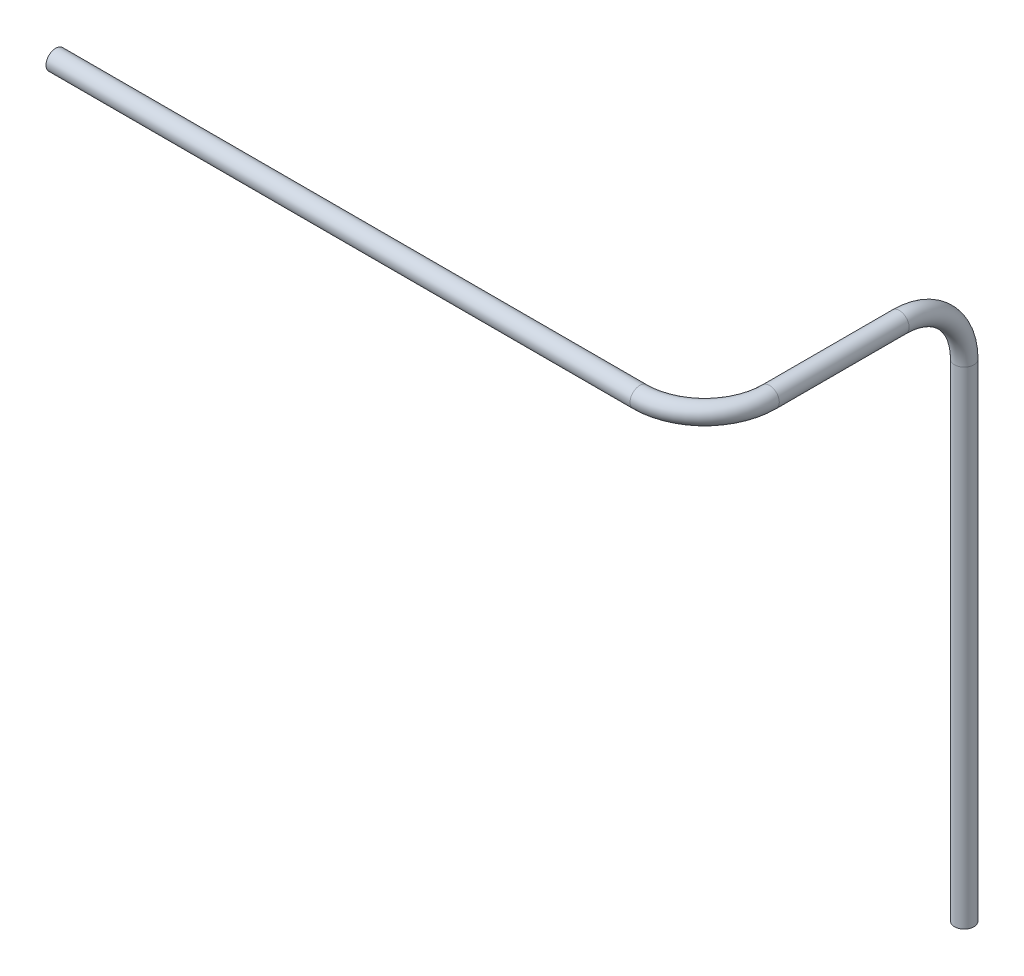
ISO-10303-21;
HEADER;
FILE_DESCRIPTION(('STEP AP214'),'2;1');
FILE_NAME('part.step','',(''),(''),'','','');
FILE_SCHEMA(('AUTOMOTIVE_DESIGN { 1 0 10303 214 1 1 1 1 }'));
ENDSEC;
DATA;
#1=APPLICATION_CONTEXT('core data for automotive mechanical design processes');
#2=APPLICATION_PROTOCOL_DEFINITION('international standard','automotive_design',2000,#1);
#3=PRODUCT_CONTEXT('',#1,'mechanical');
#4=PRODUCT('Part','Part','',(#3));
#5=PRODUCT_RELATED_PRODUCT_CATEGORY('part','',(#4));
#6=PRODUCT_DEFINITION_FORMATION('','',#4);
#7=PRODUCT_DEFINITION_CONTEXT('part definition',#1,'design');
#8=PRODUCT_DEFINITION('design','',#6,#7);
#9=PRODUCT_DEFINITION_SHAPE('','',#8);
#10=(LENGTH_UNIT() NAMED_UNIT(*) SI_UNIT(.MILLI.,.METRE.));
#11=(NAMED_UNIT(*) PLANE_ANGLE_UNIT() SI_UNIT($,.RADIAN.));
#12=(NAMED_UNIT(*) SI_UNIT($,.STERADIAN.) SOLID_ANGLE_UNIT());
#13=UNCERTAINTY_MEASURE_WITH_UNIT(LENGTH_MEASURE(1.E-05),#10,'distance_accuracy_value','');
#14=(GEOMETRIC_REPRESENTATION_CONTEXT(3) GLOBAL_UNCERTAINTY_ASSIGNED_CONTEXT((#13)) GLOBAL_UNIT_ASSIGNED_CONTEXT((#10,
#11,#12)) REPRESENTATION_CONTEXT('',''));
#15=CARTESIAN_POINT('',(0.,0.,0.));
#16=DIRECTION('',(0.,0.,1.));
#17=DIRECTION('',(1.,0.,0.));
#18=AXIS2_PLACEMENT_3D('',#15,#16,#17);
#19=CARTESIAN_POINT('',(-20.,170.,80.));
#20=DIRECTION('',(-1.,0.,0.));
#21=DIRECTION('',(0.,0.,1.));
#22=AXIS2_PLACEMENT_3D('',#19,#20,#21);
#23=CYLINDRICAL_SURFACE('',#22,3.);
#24=CARTESIAN_POINT('',(-20.,170.,80.));
#25=DIRECTION('',(-1.,0.,0.));
#26=DIRECTION('',(0.,-1.,0.));
#27=AXIS2_PLACEMENT_3D('',#24,#25,#26);
#28=CIRCLE('',#27,3.);
#29=CARTESIAN_POINT('',(-20.,170.,83.));
#30=VERTEX_POINT('',#29);
#31=EDGE_CURVE('E40',#30,#30,#28,.T.);
#32=CARTESIAN_POINT('',(-200.,170.,80.));
#33=DIRECTION('',(-1.,0.,0.));
#34=DIRECTION('',(0.,-1.,0.));
#35=AXIS2_PLACEMENT_3D('',#32,#33,#34);
#36=CIRCLE('',#35,3.);
#37=CARTESIAN_POINT('',(-200.,170.,83.));
#38=VERTEX_POINT('',#37);
#39=EDGE_CURVE('E10',#38,#38,#36,.T.);
#40=CARTESIAN_POINT('',(-20.,170.,83.));
#41=CARTESIAN_POINT('',(-21.875,170.,83.));
#42=CARTESIAN_POINT('',(-23.75,170.,83.));
#43=CARTESIAN_POINT('',(-27.5,170.,83.));
#44=CARTESIAN_POINT('',(-29.375,170.,83.));
#45=CARTESIAN_POINT('',(-33.125,170.,83.));
#46=CARTESIAN_POINT('',(-35.,170.,83.));
#47=CARTESIAN_POINT('',(-38.75,170.,83.));
#48=CARTESIAN_POINT('',(-40.625,170.,83.));
#49=CARTESIAN_POINT('',(-44.375,170.,83.));
#50=CARTESIAN_POINT('',(-46.25,170.,83.));
#51=CARTESIAN_POINT('',(-50.,170.,83.));
#52=CARTESIAN_POINT('',(-51.875,170.,83.));
#53=CARTESIAN_POINT('',(-55.625,170.,83.));
#54=CARTESIAN_POINT('',(-57.5,170.,83.));
#55=CARTESIAN_POINT('',(-61.25,170.,83.));
#56=CARTESIAN_POINT('',(-63.125,170.,83.));
#57=CARTESIAN_POINT('',(-66.875,170.,83.));
#58=CARTESIAN_POINT('',(-68.75,170.,83.));
#59=CARTESIAN_POINT('',(-72.5,170.,83.));
#60=CARTESIAN_POINT('',(-74.375,170.,83.));
#61=CARTESIAN_POINT('',(-78.125,170.,83.));
#62=CARTESIAN_POINT('',(-80.,170.,83.));
#63=CARTESIAN_POINT('',(-83.75,170.,83.));
#64=CARTESIAN_POINT('',(-85.625,170.,83.));
#65=CARTESIAN_POINT('',(-89.375,170.,83.));
#66=CARTESIAN_POINT('',(-91.25,170.,83.));
#67=CARTESIAN_POINT('',(-95.,170.,83.));
#68=CARTESIAN_POINT('',(-96.875,170.,83.));
#69=CARTESIAN_POINT('',(-100.625,170.,83.));
#70=CARTESIAN_POINT('',(-102.5,170.,83.));
#71=CARTESIAN_POINT('',(-106.25,170.,83.));
#72=CARTESIAN_POINT('',(-108.125,170.,83.));
#73=CARTESIAN_POINT('',(-111.875,170.,83.));
#74=CARTESIAN_POINT('',(-113.75,170.,83.));
#75=CARTESIAN_POINT('',(-117.5,170.,83.));
#76=CARTESIAN_POINT('',(-119.375,170.,83.));
#77=CARTESIAN_POINT('',(-123.125,170.,83.));
#78=CARTESIAN_POINT('',(-125.,170.,83.));
#79=CARTESIAN_POINT('',(-128.75,170.,83.));
#80=CARTESIAN_POINT('',(-130.625,170.,83.));
#81=CARTESIAN_POINT('',(-134.375,170.,83.));
#82=CARTESIAN_POINT('',(-136.25,170.,83.));
#83=CARTESIAN_POINT('',(-140.,170.,83.));
#84=CARTESIAN_POINT('',(-141.875,170.,83.));
#85=CARTESIAN_POINT('',(-145.625,170.,83.));
#86=CARTESIAN_POINT('',(-147.5,170.,83.));
#87=CARTESIAN_POINT('',(-151.25,170.,83.));
#88=CARTESIAN_POINT('',(-153.125,170.,83.));
#89=CARTESIAN_POINT('',(-156.875,170.,83.));
#90=CARTESIAN_POINT('',(-158.75,170.,83.));
#91=CARTESIAN_POINT('',(-162.5,170.,83.));
#92=CARTESIAN_POINT('',(-164.375,170.,83.));
#93=CARTESIAN_POINT('',(-168.125,170.,83.));
#94=CARTESIAN_POINT('',(-170.,170.,83.));
#95=CARTESIAN_POINT('',(-173.75,170.,83.));
#96=CARTESIAN_POINT('',(-175.625,170.,83.));
#97=CARTESIAN_POINT('',(-179.375,170.,83.));
#98=CARTESIAN_POINT('',(-181.25,170.,83.));
#99=CARTESIAN_POINT('',(-185.,170.,83.));
#100=CARTESIAN_POINT('',(-186.875,170.,83.));
#101=CARTESIAN_POINT('',(-190.625,170.,83.));
#102=CARTESIAN_POINT('',(-192.5,170.,83.));
#103=CARTESIAN_POINT('',(-196.25,170.,83.));
#104=CARTESIAN_POINT('',(-198.125,170.,83.));
#105=CARTESIAN_POINT('',(-200.,170.,83.));
#106=B_SPLINE_CURVE_WITH_KNOTS('',3,(#40,#41,#42,#43,#44,#45,#46,#47,#48,#49,#50,#51,#52,#53,
#54,#55,#56,#57,#58,#59,#60,#61,#62,#63,#64,#65,#66,#67,#68,#69,#70,#71,#72,#73,#74,#75,#76,#77,
#78,#79,#80,#81,#82,#83,#84,#85,#86,#87,#88,#89,#90,#91,#92,#93,#94,#95,#96,#97,#98,#99,#100,
#101,#102,#103,#104,#105),.UNSPECIFIED.,.F.,.F.,(4,2,2,2,2,2,2,2,2,2,2,2,2,2,2,2,2,2,2,2,2,2,2,
2,2,2,2,2,2,2,2,2,4),(0.,5.625,11.25,16.875,22.5,28.125,33.75,39.375,45.,50.625,56.25,61.875,
67.5,73.125,78.75,84.375,90.,95.625,101.25,106.875,112.5,118.125,123.75,129.375,135.,140.625,
146.25,151.875,157.5,163.125,168.75,174.375,180.),.UNSPECIFIED.);
#107=EDGE_CURVE('BSEAM30',#30,#38,#106,.T.);
#108=ORIENTED_EDGE('',*,*,#31,.T.);
#109=ORIENTED_EDGE('',*,*,#39,.F.);
#110=ORIENTED_EDGE('',*,*,#107,.T.);
#111=ORIENTED_EDGE('',*,*,#107,.F.);
#112=EDGE_LOOP('',(#108,#110,#109,#111));
#113=FACE_BOUND('',#112,.T.);
#114=ADVANCED_FACE('F30',(#113),#23,.T.);
#115=CARTESIAN_POINT('',(-20.,170.,80.));
#116=DIRECTION('',(-1.,0.,0.));
#117=DIRECTION('',(0.,0.,1.));
#118=AXIS2_PLACEMENT_3D('',#115,#116,#117);
#119=CYLINDRICAL_SURFACE('',#118,2.);
#120=CARTESIAN_POINT('',(-20.,170.,80.));
#121=DIRECTION('',(-1.,0.,0.));
#122=DIRECTION('',(0.,-1.,0.));
#123=AXIS2_PLACEMENT_3D('',#120,#121,#122);
#124=CIRCLE('',#123,2.);
#125=CARTESIAN_POINT('',(-20.,170.,82.));
#126=VERTEX_POINT('',#125);
#127=EDGE_CURVE('E44',#126,#126,#124,.T.);
#128=CARTESIAN_POINT('',(-200.,170.,80.));
#129=DIRECTION('',(-1.,0.,0.));
#130=DIRECTION('',(0.,-1.,0.));
#131=AXIS2_PLACEMENT_3D('',#128,#129,#130);
#132=CIRCLE('',#131,2.);
#133=CARTESIAN_POINT('',(-200.,170.,82.));
#134=VERTEX_POINT('',#133);
#135=EDGE_CURVE('E36',#134,#134,#132,.T.);
#136=CARTESIAN_POINT('',(-20.,170.,82.));
#137=CARTESIAN_POINT('',(-21.875,170.,82.));
#138=CARTESIAN_POINT('',(-23.75,170.,82.));
#139=CARTESIAN_POINT('',(-27.5,170.,82.));
#140=CARTESIAN_POINT('',(-29.375,170.,82.));
#141=CARTESIAN_POINT('',(-33.125,170.,82.));
#142=CARTESIAN_POINT('',(-35.,170.,82.));
#143=CARTESIAN_POINT('',(-38.75,170.,82.));
#144=CARTESIAN_POINT('',(-40.625,170.,82.));
#145=CARTESIAN_POINT('',(-44.375,170.,82.));
#146=CARTESIAN_POINT('',(-46.25,170.,82.));
#147=CARTESIAN_POINT('',(-50.,170.,82.));
#148=CARTESIAN_POINT('',(-51.875,170.,82.));
#149=CARTESIAN_POINT('',(-55.625,170.,82.));
#150=CARTESIAN_POINT('',(-57.5,170.,82.));
#151=CARTESIAN_POINT('',(-61.25,170.,82.));
#152=CARTESIAN_POINT('',(-63.125,170.,82.));
#153=CARTESIAN_POINT('',(-66.875,170.,82.));
#154=CARTESIAN_POINT('',(-68.75,170.,82.));
#155=CARTESIAN_POINT('',(-72.5,170.,82.));
#156=CARTESIAN_POINT('',(-74.375,170.,82.));
#157=CARTESIAN_POINT('',(-78.125,170.,82.));
#158=CARTESIAN_POINT('',(-80.,170.,82.));
#159=CARTESIAN_POINT('',(-83.75,170.,82.));
#160=CARTESIAN_POINT('',(-85.625,170.,82.));
#161=CARTESIAN_POINT('',(-89.375,170.,82.));
#162=CARTESIAN_POINT('',(-91.25,170.,82.));
#163=CARTESIAN_POINT('',(-95.,170.,82.));
#164=CARTESIAN_POINT('',(-96.875,170.,82.));
#165=CARTESIAN_POINT('',(-100.625,170.,82.));
#166=CARTESIAN_POINT('',(-102.5,170.,82.));
#167=CARTESIAN_POINT('',(-106.25,170.,82.));
#168=CARTESIAN_POINT('',(-108.125,170.,82.));
#169=CARTESIAN_POINT('',(-111.875,170.,82.));
#170=CARTESIAN_POINT('',(-113.75,170.,82.));
#171=CARTESIAN_POINT('',(-117.5,170.,82.));
#172=CARTESIAN_POINT('',(-119.375,170.,82.));
#173=CARTESIAN_POINT('',(-123.125,170.,82.));
#174=CARTESIAN_POINT('',(-125.,170.,82.));
#175=CARTESIAN_POINT('',(-128.75,170.,82.));
#176=CARTESIAN_POINT('',(-130.625,170.,82.));
#177=CARTESIAN_POINT('',(-134.375,170.,82.));
#178=CARTESIAN_POINT('',(-136.25,170.,82.));
#179=CARTESIAN_POINT('',(-140.,170.,82.));
#180=CARTESIAN_POINT('',(-141.875,170.,82.));
#181=CARTESIAN_POINT('',(-145.625,170.,82.));
#182=CARTESIAN_POINT('',(-147.5,170.,82.));
#183=CARTESIAN_POINT('',(-151.25,170.,82.));
#184=CARTESIAN_POINT('',(-153.125,170.,82.));
#185=CARTESIAN_POINT('',(-156.875,170.,82.));
#186=CARTESIAN_POINT('',(-158.75,170.,82.));
#187=CARTESIAN_POINT('',(-162.5,170.,82.));
#188=CARTESIAN_POINT('',(-164.375,170.,82.));
#189=CARTESIAN_POINT('',(-168.125,170.,82.));
#190=CARTESIAN_POINT('',(-170.,170.,82.));
#191=CARTESIAN_POINT('',(-173.75,170.,82.));
#192=CARTESIAN_POINT('',(-175.625,170.,82.));
#193=CARTESIAN_POINT('',(-179.375,170.,82.));
#194=CARTESIAN_POINT('',(-181.25,170.,82.));
#195=CARTESIAN_POINT('',(-185.,170.,82.));
#196=CARTESIAN_POINT('',(-186.875,170.,82.));
#197=CARTESIAN_POINT('',(-190.625,170.,82.));
#198=CARTESIAN_POINT('',(-192.5,170.,82.));
#199=CARTESIAN_POINT('',(-196.25,170.,82.));
#200=CARTESIAN_POINT('',(-198.125,170.,82.));
#201=CARTESIAN_POINT('',(-200.,170.,82.));
#202=B_SPLINE_CURVE_WITH_KNOTS('',3,(#136,#137,#138,#139,#140,#141,#142,#143,#144,#145,#146,
#147,#148,#149,#150,#151,#152,#153,#154,#155,#156,#157,#158,#159,#160,#161,#162,#163,#164,#165,
#166,#167,#168,#169,#170,#171,#172,#173,#174,#175,#176,#177,#178,#179,#180,#181,#182,#183,#184,
#185,#186,#187,#188,#189,#190,#191,#192,#193,#194,#195,#196,#197,#198,#199,#200,#201),
.UNSPECIFIED.,.F.,.F.,(4,2,2,2,2,2,2,2,2,2,2,2,2,2,2,2,2,2,2,2,2,2,2,2,2,2,2,2,2,2,2,2,4),(0.,
5.625,11.25,16.875,22.5,28.125,33.75,39.375,45.,50.625,56.25,61.875,67.5,73.125,78.75,84.375,
90.,95.625,101.25,106.875,112.5,118.125,123.75,129.375,135.,140.625,146.25,151.875,157.5,
163.125,168.75,174.375,180.),.UNSPECIFIED.);
#203=EDGE_CURVE('BSEAM98',#126,#134,#202,.T.);
#204=ORIENTED_EDGE('',*,*,#127,.F.);
#205=ORIENTED_EDGE('',*,*,#135,.T.);
#206=ORIENTED_EDGE('',*,*,#203,.T.);
#207=ORIENTED_EDGE('',*,*,#203,.F.);
#208=EDGE_LOOP('',(#204,#206,#205,#207));
#209=FACE_BOUND('',#208,.T.);
#210=ADVANCED_FACE('F98',(#209),#119,.F.);
#211=CARTESIAN_POINT('',(-20.,170.,60.));
#212=DIRECTION('',(0.,-1.,0.));
#213=DIRECTION('',(0.,0.,-1.));
#214=AXIS2_PLACEMENT_3D('',#211,#212,#213);
#215=TOROIDAL_SURFACE('',#214,20.,3.);
#216=CARTESIAN_POINT('',(0.,170.,60.));
#217=DIRECTION('',(0.,0.,1.));
#218=DIRECTION('',(0.,-1.,0.));
#219=AXIS2_PLACEMENT_3D('',#216,#217,#218);
#220=CIRCLE('',#219,3.);
#221=CARTESIAN_POINT('',(3.,170.,60.));
#222=VERTEX_POINT('',#221);
#223=EDGE_CURVE('E49',#222,#222,#220,.T.);
#224=CARTESIAN_POINT('',(-20.,170.,60.));
#225=DIRECTION('',(0.,-1.,0.));
#226=DIRECTION('',(0.,0.,-1.));
#227=AXIS2_PLACEMENT_3D('',#224,#225,#226);
#228=CIRCLE('',#227,23.);
#229=EDGE_CURVE('',#222,#30,#228,.T.);
#230=ORIENTED_EDGE('',*,*,#223,.T.);
#231=ORIENTED_EDGE('',*,*,#31,.F.);
#232=ORIENTED_EDGE('',*,*,#229,.T.);
#233=ORIENTED_EDGE('',*,*,#229,.F.);
#234=EDGE_LOOP('',(#230,#232,#231,#233));
#235=FACE_BOUND('',#234,.T.);
#236=ADVANCED_FACE('F94',(#235),#215,.T.);
#237=CARTESIAN_POINT('',(-20.,170.,60.));
#238=DIRECTION('',(0.,-1.,0.));
#239=DIRECTION('',(0.,0.,-1.));
#240=AXIS2_PLACEMENT_3D('',#237,#238,#239);
#241=TOROIDAL_SURFACE('',#240,20.,2.);
#242=CARTESIAN_POINT('',(0.,170.,60.));
#243=DIRECTION('',(0.,0.,1.));
#244=DIRECTION('',(0.,-1.,0.));
#245=AXIS2_PLACEMENT_3D('',#242,#243,#244);
#246=CIRCLE('',#245,2.);
#247=CARTESIAN_POINT('',(2.,170.,60.));
#248=VERTEX_POINT('',#247);
#249=EDGE_CURVE('E52',#248,#248,#246,.T.);
#250=CARTESIAN_POINT('',(-20.,170.,60.));
#251=DIRECTION('',(0.,-1.,0.));
#252=DIRECTION('',(0.,0.,-1.));
#253=AXIS2_PLACEMENT_3D('',#250,#251,#252);
#254=CIRCLE('',#253,22.);
#255=EDGE_CURVE('',#248,#126,#254,.T.);
#256=ORIENTED_EDGE('',*,*,#249,.F.);
#257=ORIENTED_EDGE('',*,*,#127,.T.);
#258=ORIENTED_EDGE('',*,*,#255,.T.);
#259=ORIENTED_EDGE('',*,*,#255,.F.);
#260=EDGE_LOOP('',(#256,#258,#257,#259));
#261=FACE_BOUND('',#260,.T.);
#262=ADVANCED_FACE('F91',(#261),#241,.F.);
#263=CARTESIAN_POINT('',(0.,170.,20.));
#264=DIRECTION('',(0.,0.,1.));
#265=DIRECTION('',(1.,0.,0.));
#266=AXIS2_PLACEMENT_3D('',#263,#264,#265);
#267=CYLINDRICAL_SURFACE('',#266,3.);
#268=CARTESIAN_POINT('',(0.,170.,20.));
#269=DIRECTION('',(0.,0.,1.));
#270=DIRECTION('',(0.,-1.,0.));
#271=AXIS2_PLACEMENT_3D('',#268,#269,#270);
#272=CIRCLE('',#271,3.);
#273=CARTESIAN_POINT('',(0.,173.,20.));
#274=VERTEX_POINT('',#273);
#275=EDGE_CURVE('E55',#274,#274,#272,.T.);
#276=ORIENTED_EDGE('',*,*,#275,.T.);
#277=EDGE_LOOP('',(#276));
#278=FACE_BOUND('',#277,.T.);
#279=ORIENTED_EDGE('',*,*,#223,.F.);
#280=EDGE_LOOP('',(#279));
#281=FACE_BOUND('',#280,.T.);
#282=ADVANCED_FACE('F87',(#278,#281),#267,.T.);
#283=CARTESIAN_POINT('',(0.,170.,20.));
#284=DIRECTION('',(0.,0.,1.));
#285=DIRECTION('',(1.,0.,0.));
#286=AXIS2_PLACEMENT_3D('',#283,#284,#285);
#287=CYLINDRICAL_SURFACE('',#286,2.);
#288=CARTESIAN_POINT('',(0.,170.,20.));
#289=DIRECTION('',(0.,0.,1.));
#290=DIRECTION('',(0.,-1.,0.));
#291=AXIS2_PLACEMENT_3D('',#288,#289,#290);
#292=CIRCLE('',#291,2.);
#293=CARTESIAN_POINT('',(0.,172.,20.));
#294=VERTEX_POINT('',#293);
#295=EDGE_CURVE('E58',#294,#294,#292,.T.);
#296=ORIENTED_EDGE('',*,*,#295,.F.);
#297=EDGE_LOOP('',(#296));
#298=FACE_BOUND('',#297,.T.);
#299=ORIENTED_EDGE('',*,*,#249,.T.);
#300=EDGE_LOOP('',(#299));
#301=FACE_BOUND('',#300,.T.);
#302=ADVANCED_FACE('F84',(#298,#301),#287,.F.);
#303=CARTESIAN_POINT('',(0.,150.,20.));
#304=DIRECTION('',(1.,0.,0.));
#305=DIRECTION('',(0.,0.,-1.));
#306=AXIS2_PLACEMENT_3D('',#303,#304,#305);
#307=TOROIDAL_SURFACE('',#306,20.,3.);
#308=CARTESIAN_POINT('',(0.,150.,0.));
#309=DIRECTION('',(0.,1.,0.));
#310=DIRECTION('',(0.,0.,1.));
#311=AXIS2_PLACEMENT_3D('',#308,#309,#310);
#312=CIRCLE('',#311,3.);
#313=CARTESIAN_POINT('',(0.,150.,-3.));
#314=VERTEX_POINT('',#313);
#315=EDGE_CURVE('E61',#314,#314,#312,.T.);
#316=CARTESIAN_POINT('',(0.,150.,20.));
#317=DIRECTION('',(1.,0.,0.));
#318=DIRECTION('',(0.,0.,-1.));
#319=AXIS2_PLACEMENT_3D('',#316,#317,#318);
#320=CIRCLE('',#319,23.);
#321=EDGE_CURVE('',#314,#274,#320,.T.);
#322=ORIENTED_EDGE('',*,*,#315,.T.);
#323=ORIENTED_EDGE('',*,*,#275,.F.);
#324=ORIENTED_EDGE('',*,*,#321,.T.);
#325=ORIENTED_EDGE('',*,*,#321,.F.);
#326=EDGE_LOOP('',(#322,#324,#323,#325));
#327=FACE_BOUND('',#326,.T.);
#328=ADVANCED_FACE('F80',(#327),#307,.T.);
#329=CARTESIAN_POINT('',(0.,150.,20.));
#330=DIRECTION('',(1.,0.,0.));
#331=DIRECTION('',(0.,0.,-1.));
#332=AXIS2_PLACEMENT_3D('',#329,#330,#331);
#333=TOROIDAL_SURFACE('',#332,20.,2.);
#334=CARTESIAN_POINT('',(0.,150.,0.));
#335=DIRECTION('',(0.,1.,0.));
#336=DIRECTION('',(0.,0.,1.));
#337=AXIS2_PLACEMENT_3D('',#334,#335,#336);
#338=CIRCLE('',#337,2.);
#339=CARTESIAN_POINT('',(0.,150.,-2.));
#340=VERTEX_POINT('',#339);
#341=EDGE_CURVE('E65',#340,#340,#338,.T.);
#342=CARTESIAN_POINT('',(0.,150.,20.));
#343=DIRECTION('',(1.,0.,0.));
#344=DIRECTION('',(0.,0.,-1.));
#345=AXIS2_PLACEMENT_3D('',#342,#343,#344);
#346=CIRCLE('',#345,22.);
#347=EDGE_CURVE('',#340,#294,#346,.T.);
#348=ORIENTED_EDGE('',*,*,#341,.F.);
#349=ORIENTED_EDGE('',*,*,#295,.T.);
#350=ORIENTED_EDGE('',*,*,#347,.T.);
#351=ORIENTED_EDGE('',*,*,#347,.F.);
#352=EDGE_LOOP('',(#348,#350,#349,#351));
#353=FACE_BOUND('',#352,.T.);
#354=ADVANCED_FACE('F77',(#353),#333,.F.);
#355=CARTESIAN_POINT('',(0.,150.,0.));
#356=DIRECTION('',(0.,-1.,0.));
#357=DIRECTION('',(0.,0.,-1.));
#358=AXIS2_PLACEMENT_3D('',#355,#356,#357);
#359=CYLINDRICAL_SURFACE('',#358,2.);
#360=ORIENTED_EDGE('',*,*,#341,.T.);
#361=EDGE_LOOP('',(#360));
#362=FACE_BOUND('',#361,.T.);
#363=CARTESIAN_POINT('',(0.,0.,0.));
#364=DIRECTION('',(0.,1.,0.));
#365=DIRECTION('',(0.,0.,1.));
#366=AXIS2_PLACEMENT_3D('',#363,#364,#365);
#367=CIRCLE('',#366,2.);
#368=CARTESIAN_POINT('',(0.,0.,2.));
#369=VERTEX_POINT('',#368);
#370=EDGE_CURVE('E66',#369,#369,#367,.T.);
#371=ORIENTED_EDGE('',*,*,#370,.F.);
#372=EDGE_LOOP('',(#371));
#373=FACE_BOUND('',#372,.T.);
#374=ADVANCED_FACE('F74',(#362,#373),#359,.F.);
#375=CARTESIAN_POINT('',(0.,150.,0.));
#376=DIRECTION('',(0.,-1.,0.));
#377=DIRECTION('',(0.,0.,-1.));
#378=AXIS2_PLACEMENT_3D('',#375,#376,#377);
#379=CYLINDRICAL_SURFACE('',#378,3.);
#380=ORIENTED_EDGE('',*,*,#315,.F.);
#381=EDGE_LOOP('',(#380));
#382=FACE_BOUND('',#381,.T.);
#383=CARTESIAN_POINT('',(0.,0.,0.));
#384=DIRECTION('',(0.,1.,0.));
#385=DIRECTION('',(0.,0.,1.));
#386=AXIS2_PLACEMENT_3D('',#383,#384,#385);
#387=CIRCLE('',#386,3.);
#388=CARTESIAN_POINT('',(0.,0.,3.));
#389=VERTEX_POINT('',#388);
#390=EDGE_CURVE('E62',#389,#389,#387,.T.);
#391=ORIENTED_EDGE('',*,*,#390,.T.);
#392=EDGE_LOOP('',(#391));
#393=FACE_BOUND('',#392,.T.);
#394=ADVANCED_FACE('F116',(#382,#393),#379,.T.);
#395=CARTESIAN_POINT('',(-200.,170.,80.));
#396=DIRECTION('',(-1.,0.,0.));
#397=DIRECTION('',(0.,-1.,0.));
#398=AXIS2_PLACEMENT_3D('',#395,#396,#397);
#399=PLANE('',#398);
#400=ORIENTED_EDGE('',*,*,#135,.F.);
#401=EDGE_LOOP('',(#400));
#402=FACE_BOUND('',#401,.T.);
#403=ORIENTED_EDGE('',*,*,#39,.T.);
#404=EDGE_LOOP('',(#403));
#405=FACE_BOUND('',#404,.T.);
#406=ADVANCED_FACE('F119',(#402,#405),#399,.T.);
#407=CARTESIAN_POINT('',(0.,0.,0.));
#408=DIRECTION('',(0.,1.,0.));
#409=DIRECTION('',(0.,0.,1.));
#410=AXIS2_PLACEMENT_3D('',#407,#408,#409);
#411=PLANE('',#410);
#412=ORIENTED_EDGE('',*,*,#370,.T.);
#413=EDGE_LOOP('',(#412));
#414=FACE_BOUND('',#413,.T.);
#415=ORIENTED_EDGE('',*,*,#390,.F.);
#416=EDGE_LOOP('',(#415));
#417=FACE_BOUND('',#416,.T.);
#418=ADVANCED_FACE('F121',(#414,#417),#411,.F.);
#419=CLOSED_SHELL('',(#114,#210,#236,#262,#282,#302,#328,#354,#374,#394,#406,#418));
#420=MANIFOLD_SOLID_BREP('B2',#419);
#421=ADVANCED_BREP_SHAPE_REPRESENTATION('',(#18,#420),#14);
#422=SHAPE_DEFINITION_REPRESENTATION(#9,#421);
ENDSEC;
END-ISO-10303-21;
